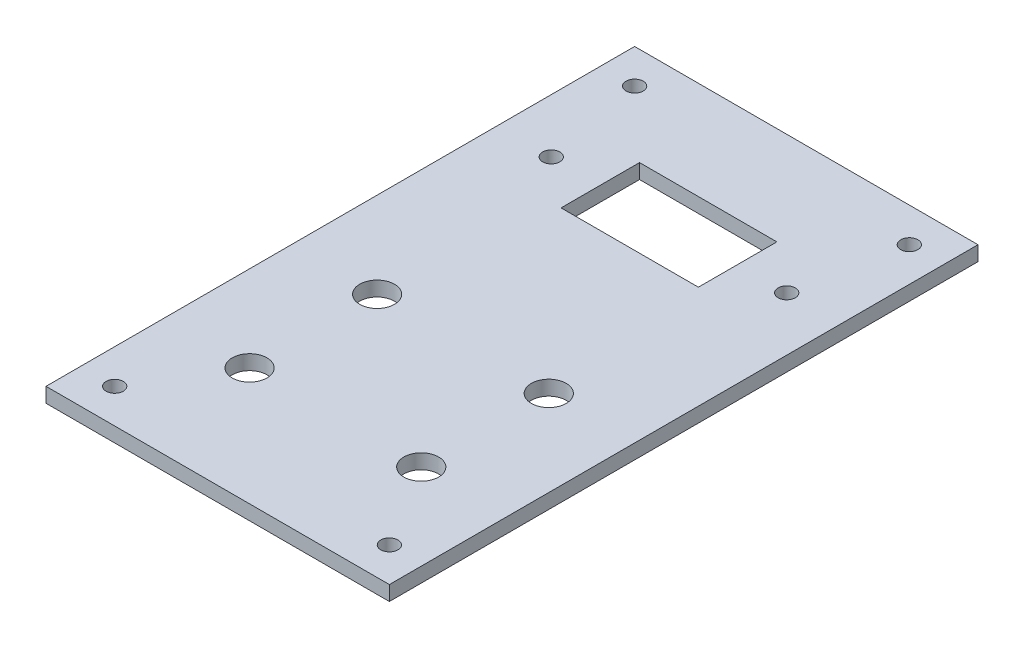
ISO-10303-21;
HEADER;
FILE_DESCRIPTION(('STEP AP214'),'2;1');
FILE_NAME('part.step','',(''),(''),'','','');
FILE_SCHEMA(('AUTOMOTIVE_DESIGN { 1 0 10303 214 1 1 1 1 }'));
ENDSEC;
DATA;
#1=APPLICATION_CONTEXT('core data for automotive mechanical design processes');
#2=APPLICATION_PROTOCOL_DEFINITION('international standard','automotive_design',2000,#1);
#3=PRODUCT_CONTEXT('',#1,'mechanical');
#4=PRODUCT('Part','Part','',(#3));
#5=PRODUCT_RELATED_PRODUCT_CATEGORY('part','',(#4));
#6=PRODUCT_DEFINITION_FORMATION('','',#4);
#7=PRODUCT_DEFINITION_CONTEXT('part definition',#1,'design');
#8=PRODUCT_DEFINITION('design','',#6,#7);
#9=PRODUCT_DEFINITION_SHAPE('','',#8);
#10=(LENGTH_UNIT() NAMED_UNIT(*) SI_UNIT(.MILLI.,.METRE.));
#11=(NAMED_UNIT(*) PLANE_ANGLE_UNIT() SI_UNIT($,.RADIAN.));
#12=(NAMED_UNIT(*) SI_UNIT($,.STERADIAN.) SOLID_ANGLE_UNIT());
#13=UNCERTAINTY_MEASURE_WITH_UNIT(LENGTH_MEASURE(1.E-05),#10,'distance_accuracy_value','');
#14=(GEOMETRIC_REPRESENTATION_CONTEXT(3) GLOBAL_UNCERTAINTY_ASSIGNED_CONTEXT((#13)) GLOBAL_UNIT_ASSIGNED_CONTEXT((#10,
#11,#12)) REPRESENTATION_CONTEXT('',''));
#15=CARTESIAN_POINT('',(0.,0.,0.));
#16=DIRECTION('',(0.,0.,1.));
#17=DIRECTION('',(1.,0.,0.));
#18=AXIS2_PLACEMENT_3D('',#15,#16,#17);
#19=CARTESIAN_POINT('',(0.,3.,0.));
#20=DIRECTION('',(1.,0.,0.));
#21=DIRECTION('',(0.,0.,-1.));
#22=AXIS2_PLACEMENT_3D('',#19,#20,#21);
#23=PLANE('',#22);
#24=DIRECTION('',(0.,0.,1.));
#25=VECTOR('',#24,1.);
#26=CARTESIAN_POINT('',(0.,0.,0.));
#27=LINE('',#26,#25);
#28=CARTESIAN_POINT('',(0.,0.,-120.));
#29=VERTEX_POINT('',#28);
#30=CARTESIAN_POINT('',(0.,0.,0.));
#31=VERTEX_POINT('',#30);
#32=EDGE_CURVE('E145',#29,#31,#27,.T.);
#33=ORIENTED_EDGE('',*,*,#32,.T.);
#34=DIRECTION('',(0.,-1.,0.));
#35=VECTOR('',#34,1.);
#36=CARTESIAN_POINT('',(0.,3.,0.));
#37=LINE('',#36,#35);
#38=CARTESIAN_POINT('',(0.,3.,0.));
#39=VERTEX_POINT('',#38);
#40=EDGE_CURVE('E11',#39,#31,#37,.T.);
#41=ORIENTED_EDGE('',*,*,#40,.F.);
#42=DIRECTION('',(0.,0.,1.));
#43=VECTOR('',#42,1.);
#44=CARTESIAN_POINT('',(0.,3.,0.));
#45=LINE('',#44,#43);
#46=CARTESIAN_POINT('',(0.,3.,-120.));
#47=VERTEX_POINT('',#46);
#48=EDGE_CURVE('E147',#47,#39,#45,.T.);
#49=ORIENTED_EDGE('',*,*,#48,.F.);
#50=DIRECTION('',(0.,-1.,0.));
#51=VECTOR('',#50,1.);
#52=CARTESIAN_POINT('',(0.,3.,-120.));
#53=LINE('',#52,#51);
#54=EDGE_CURVE('E156',#47,#29,#53,.T.);
#55=ORIENTED_EDGE('',*,*,#54,.T.);
#56=EDGE_LOOP('',(#33,#41,#49,#55));
#57=FACE_BOUND('',#56,.T.);
#58=ADVANCED_FACE('F39',(#57),#23,.F.);
#59=CARTESIAN_POINT('',(0.,3.,0.));
#60=DIRECTION('',(0.,0.,-1.));
#61=DIRECTION('',(-1.,0.,0.));
#62=AXIS2_PLACEMENT_3D('',#59,#60,#61);
#63=PLANE('',#62);
#64=DIRECTION('',(1.,0.,0.));
#65=VECTOR('',#64,1.);
#66=CARTESIAN_POINT('',(0.,0.,0.));
#67=LINE('',#66,#65);
#68=CARTESIAN_POINT('',(70.,0.,0.));
#69=VERTEX_POINT('',#68);
#70=EDGE_CURVE('E158',#31,#69,#67,.T.);
#71=ORIENTED_EDGE('',*,*,#70,.T.);
#72=DIRECTION('',(0.,-1.,0.));
#73=VECTOR('',#72,1.);
#74=CARTESIAN_POINT('',(70.,3.,0.));
#75=LINE('',#74,#73);
#76=CARTESIAN_POINT('',(70.,3.,0.));
#77=VERTEX_POINT('',#76);
#78=EDGE_CURVE('E50',#77,#69,#75,.T.);
#79=ORIENTED_EDGE('',*,*,#78,.F.);
#80=DIRECTION('',(1.,0.,0.));
#81=VECTOR('',#80,1.);
#82=CARTESIAN_POINT('',(0.,3.,0.));
#83=LINE('',#82,#81);
#84=EDGE_CURVE('E146',#39,#77,#83,.T.);
#85=ORIENTED_EDGE('',*,*,#84,.F.);
#86=ORIENTED_EDGE('',*,*,#40,.T.);
#87=EDGE_LOOP('',(#71,#79,#85,#86));
#88=FACE_BOUND('',#87,.T.);
#89=ADVANCED_FACE('F249',(#88),#63,.F.);
#90=CARTESIAN_POINT('',(70.,3.,0.));
#91=DIRECTION('',(-1.,0.,0.));
#92=DIRECTION('',(0.,0.,1.));
#93=AXIS2_PLACEMENT_3D('',#90,#91,#92);
#94=PLANE('',#93);
#95=DIRECTION('',(0.,0.,-1.));
#96=VECTOR('',#95,1.);
#97=CARTESIAN_POINT('',(70.,0.,0.));
#98=LINE('',#97,#96);
#99=CARTESIAN_POINT('',(70.,0.,-120.));
#100=VERTEX_POINT('',#99);
#101=EDGE_CURVE('E163',#69,#100,#98,.T.);
#102=ORIENTED_EDGE('',*,*,#101,.T.);
#103=DIRECTION('',(0.,-1.,0.));
#104=VECTOR('',#103,1.);
#105=CARTESIAN_POINT('',(70.,3.,-120.));
#106=LINE('',#105,#104);
#107=CARTESIAN_POINT('',(70.,3.,-120.));
#108=VERTEX_POINT('',#107);
#109=EDGE_CURVE('E168',#108,#100,#106,.T.);
#110=ORIENTED_EDGE('',*,*,#109,.F.);
#111=DIRECTION('',(0.,0.,-1.));
#112=VECTOR('',#111,1.);
#113=CARTESIAN_POINT('',(70.,3.,0.));
#114=LINE('',#113,#112);
#115=EDGE_CURVE('E155',#77,#108,#114,.T.);
#116=ORIENTED_EDGE('',*,*,#115,.F.);
#117=ORIENTED_EDGE('',*,*,#78,.T.);
#118=EDGE_LOOP('',(#102,#110,#116,#117));
#119=FACE_BOUND('',#118,.T.);
#120=ADVANCED_FACE('F253',(#119),#94,.F.);
#121=CARTESIAN_POINT('',(0.,3.,-120.));
#122=DIRECTION('',(0.,0.,1.));
#123=DIRECTION('',(1.,0.,0.));
#124=AXIS2_PLACEMENT_3D('',#121,#122,#123);
#125=PLANE('',#124);
#126=DIRECTION('',(-1.,0.,0.));
#127=VECTOR('',#126,1.);
#128=CARTESIAN_POINT('',(0.,0.,-120.));
#129=LINE('',#128,#127);
#130=EDGE_CURVE('E148',#100,#29,#129,.T.);
#131=ORIENTED_EDGE('',*,*,#130,.T.);
#132=ORIENTED_EDGE('',*,*,#54,.F.);
#133=DIRECTION('',(-1.,0.,0.));
#134=VECTOR('',#133,1.);
#135=CARTESIAN_POINT('',(0.,3.,-120.));
#136=LINE('',#135,#134);
#137=EDGE_CURVE('E152',#108,#47,#136,.T.);
#138=ORIENTED_EDGE('',*,*,#137,.F.);
#139=ORIENTED_EDGE('',*,*,#109,.T.);
#140=EDGE_LOOP('',(#131,#132,#138,#139));
#141=FACE_BOUND('',#140,.T.);
#142=ADVANCED_FACE('F270',(#141),#125,.F.);
#143=CARTESIAN_POINT('',(0.,3.,0.));
#144=DIRECTION('',(0.,-1.,0.));
#145=DIRECTION('',(0.,0.,-1.));
#146=AXIS2_PLACEMENT_3D('',#143,#144,#145);
#147=PLANE('',#146);
#148=CARTESIAN_POINT('',(17.5,3.,-50.));
#149=DIRECTION('',(0.,1.,0.));
#150=DIRECTION('',(0.,0.,1.));
#151=AXIS2_PLACEMENT_3D('',#148,#149,#150);
#152=CIRCLE('',#151,3.55);
#153=CARTESIAN_POINT('',(17.5,3.,-46.45));
#154=VERTEX_POINT('',#153);
#155=EDGE_CURVE('E175',#154,#154,#152,.T.);
#156=ORIENTED_EDGE('',*,*,#155,.F.);
#157=EDGE_LOOP('',(#156));
#158=FACE_BOUND('',#157,.T.);
#159=CARTESIAN_POINT('',(52.5,3.,-50.));
#160=DIRECTION('',(0.,1.,0.));
#161=DIRECTION('',(0.,0.,1.));
#162=AXIS2_PLACEMENT_3D('',#159,#160,#161);
#163=CIRCLE('',#162,3.55000000000001);
#164=CARTESIAN_POINT('',(52.5,3.,-46.45));
#165=VERTEX_POINT('',#164);
#166=EDGE_CURVE('E178',#165,#165,#163,.T.);
#167=ORIENTED_EDGE('',*,*,#166,.F.);
#168=EDGE_LOOP('',(#167));
#169=FACE_BOUND('',#168,.T.);
#170=CARTESIAN_POINT('',(11.,3.,-92.0000000000001));
#171=DIRECTION('',(0.,1.,0.));
#172=DIRECTION('',(0.,0.,1.));
#173=AXIS2_PLACEMENT_3D('',#170,#171,#172);
#174=CIRCLE('',#173,1.75000000000001);
#175=CARTESIAN_POINT('',(11.,3.,-90.2500000000001));
#176=VERTEX_POINT('',#175);
#177=EDGE_CURVE('E136',#176,#176,#174,.T.);
#178=ORIENTED_EDGE('',*,*,#177,.F.);
#179=EDGE_LOOP('',(#178));
#180=FACE_BOUND('',#179,.T.);
#181=CARTESIAN_POINT('',(59.,3.,-92.0000000000001));
#182=DIRECTION('',(0.,1.,0.));
#183=DIRECTION('',(0.,0.,1.));
#184=AXIS2_PLACEMENT_3D('',#181,#182,#183);
#185=CIRCLE('',#184,1.75);
#186=CARTESIAN_POINT('',(59.,3.,-90.2500000000001));
#187=VERTEX_POINT('',#186);
#188=EDGE_CURVE('E214',#187,#187,#185,.T.);
#189=ORIENTED_EDGE('',*,*,#188,.F.);
#190=EDGE_LOOP('',(#189));
#191=FACE_BOUND('',#190,.T.);
#192=CARTESIAN_POINT('',(52.5,3.,-24.));
#193=DIRECTION('',(0.,1.,0.));
#194=DIRECTION('',(0.,0.,1.));
#195=AXIS2_PLACEMENT_3D('',#192,#193,#194);
#196=CIRCLE('',#195,3.55);
#197=CARTESIAN_POINT('',(52.5,3.,-20.45));
#198=VERTEX_POINT('',#197);
#199=EDGE_CURVE('E217',#198,#198,#196,.T.);
#200=ORIENTED_EDGE('',*,*,#199,.F.);
#201=EDGE_LOOP('',(#200));
#202=FACE_BOUND('',#201,.T.);
#203=CARTESIAN_POINT('',(17.5,3.,-24.));
#204=DIRECTION('',(0.,1.,0.));
#205=DIRECTION('',(0.,0.,1.));
#206=AXIS2_PLACEMENT_3D('',#203,#204,#205);
#207=CIRCLE('',#206,3.55);
#208=CARTESIAN_POINT('',(17.5,3.,-20.45));
#209=VERTEX_POINT('',#208);
#210=EDGE_CURVE('E223',#209,#209,#207,.T.);
#211=ORIENTED_EDGE('',*,*,#210,.F.);
#212=EDGE_LOOP('',(#211));
#213=FACE_BOUND('',#212,.T.);
#214=CARTESIAN_POINT('',(7.,3.,-113.));
#215=DIRECTION('',(0.,1.,0.));
#216=DIRECTION('',(0.,0.,1.));
#217=AXIS2_PLACEMENT_3D('',#214,#215,#216);
#218=CIRCLE('',#217,1.75);
#219=CARTESIAN_POINT('',(7.,3.,-111.25));
#220=VERTEX_POINT('',#219);
#221=EDGE_CURVE('E184',#220,#220,#218,.T.);
#222=ORIENTED_EDGE('',*,*,#221,.F.);
#223=EDGE_LOOP('',(#222));
#224=FACE_BOUND('',#223,.T.);
#225=CARTESIAN_POINT('',(63.,3.,-113.));
#226=DIRECTION('',(0.,1.,0.));
#227=DIRECTION('',(0.,0.,1.));
#228=AXIS2_PLACEMENT_3D('',#225,#226,#227);
#229=CIRCLE('',#228,1.75);
#230=CARTESIAN_POINT('',(63.,3.,-111.25));
#231=VERTEX_POINT('',#230);
#232=EDGE_CURVE('E192',#231,#231,#229,.T.);
#233=ORIENTED_EDGE('',*,*,#232,.F.);
#234=EDGE_LOOP('',(#233));
#235=FACE_BOUND('',#234,.T.);
#236=CARTESIAN_POINT('',(63.,3.,-7.));
#237=DIRECTION('',(0.,1.,0.));
#238=DIRECTION('',(0.,0.,1.));
#239=AXIS2_PLACEMENT_3D('',#236,#237,#238);
#240=CIRCLE('',#239,1.75);
#241=CARTESIAN_POINT('',(63.,3.,-5.25));
#242=VERTEX_POINT('',#241);
#243=EDGE_CURVE('E200',#242,#242,#240,.T.);
#244=ORIENTED_EDGE('',*,*,#243,.F.);
#245=EDGE_LOOP('',(#244));
#246=FACE_BOUND('',#245,.T.);
#247=CARTESIAN_POINT('',(7.,3.,-7.));
#248=DIRECTION('',(0.,1.,0.));
#249=DIRECTION('',(0.,0.,1.));
#250=AXIS2_PLACEMENT_3D('',#247,#248,#249);
#251=CIRCLE('',#250,1.75);
#252=CARTESIAN_POINT('',(7.,3.,-5.25));
#253=VERTEX_POINT('',#252);
#254=EDGE_CURVE('E204',#253,#253,#251,.T.);
#255=ORIENTED_EDGE('',*,*,#254,.F.);
#256=EDGE_LOOP('',(#255));
#257=FACE_BOUND('',#256,.T.);
#258=DIRECTION('',(1.,0.,0.));
#259=VECTOR('',#258,1.);
#260=CARTESIAN_POINT('',(21.,3.,-84.));
#261=LINE('',#260,#259);
#262=CARTESIAN_POINT('',(21.,3.,-84.));
#263=VERTEX_POINT('',#262);
#264=CARTESIAN_POINT('',(49.,3.,-84.));
#265=VERTEX_POINT('',#264);
#266=EDGE_CURVE('E134',#263,#265,#261,.T.);
#267=ORIENTED_EDGE('',*,*,#266,.F.);
#268=DIRECTION('',(0.,0.,1.));
#269=VECTOR('',#268,1.);
#270=CARTESIAN_POINT('',(21.,3.,-100.));
#271=LINE('',#270,#269);
#272=CARTESIAN_POINT('',(21.,3.,-100.));
#273=VERTEX_POINT('',#272);
#274=EDGE_CURVE('E54',#273,#263,#271,.T.);
#275=ORIENTED_EDGE('',*,*,#274,.F.);
#276=DIRECTION('',(-1.,0.,0.));
#277=VECTOR('',#276,1.);
#278=CARTESIAN_POINT('',(21.,3.,-100.));
#279=LINE('',#278,#277);
#280=CARTESIAN_POINT('',(49.,3.,-100.));
#281=VERTEX_POINT('',#280);
#282=EDGE_CURVE('E124',#281,#273,#279,.T.);
#283=ORIENTED_EDGE('',*,*,#282,.F.);
#284=DIRECTION('',(0.,0.,-1.));
#285=VECTOR('',#284,1.);
#286=CARTESIAN_POINT('',(49.,3.,-100.));
#287=LINE('',#286,#285);
#288=EDGE_CURVE('E127',#265,#281,#287,.T.);
#289=ORIENTED_EDGE('',*,*,#288,.F.);
#290=EDGE_LOOP('',(#267,#275,#283,#289));
#291=FACE_BOUND('',#290,.T.);
#292=ORIENTED_EDGE('',*,*,#48,.T.);
#293=ORIENTED_EDGE('',*,*,#84,.T.);
#294=ORIENTED_EDGE('',*,*,#115,.T.);
#295=ORIENTED_EDGE('',*,*,#137,.T.);
#296=EDGE_LOOP('',(#292,#293,#294,#295));
#297=FACE_BOUND('',#296,.T.);
#298=ADVANCED_FACE('F266',(#158,#169,#180,#191,#202,#213,#224,#235,#246,#257,#291,#297),#147,.F.);
#299=CARTESIAN_POINT('',(0.,0.,0.));
#300=DIRECTION('',(0.,-1.,0.));
#301=DIRECTION('',(0.,0.,-1.));
#302=AXIS2_PLACEMENT_3D('',#299,#300,#301);
#303=PLANE('',#302);
#304=CARTESIAN_POINT('',(17.5,0.,-50.));
#305=DIRECTION('',(0.,-1.,0.));
#306=DIRECTION('',(0.,0.,-1.));
#307=AXIS2_PLACEMENT_3D('',#304,#305,#306);
#308=CIRCLE('',#307,3.55);
#309=CARTESIAN_POINT('',(17.5,0.,-53.55));
#310=VERTEX_POINT('',#309);
#311=EDGE_CURVE('E45',#310,#310,#308,.T.);
#312=ORIENTED_EDGE('',*,*,#311,.F.);
#313=EDGE_LOOP('',(#312));
#314=FACE_BOUND('',#313,.T.);
#315=CARTESIAN_POINT('',(52.5,0.,-50.));
#316=DIRECTION('',(0.,-1.,0.));
#317=DIRECTION('',(0.,0.,-1.));
#318=AXIS2_PLACEMENT_3D('',#315,#316,#317);
#319=CIRCLE('',#318,3.55000000000001);
#320=CARTESIAN_POINT('',(52.5,0.,-53.55));
#321=VERTEX_POINT('',#320);
#322=EDGE_CURVE('E167',#321,#321,#319,.T.);
#323=ORIENTED_EDGE('',*,*,#322,.F.);
#324=EDGE_LOOP('',(#323));
#325=FACE_BOUND('',#324,.T.);
#326=CARTESIAN_POINT('',(11.,0.,-92.0000000000001));
#327=DIRECTION('',(0.,1.,0.));
#328=DIRECTION('',(0.,0.,1.));
#329=AXIS2_PLACEMENT_3D('',#326,#327,#328);
#330=CIRCLE('',#329,1.75000000000001);
#331=CARTESIAN_POINT('',(11.,0.,-90.2500000000001));
#332=VERTEX_POINT('',#331);
#333=EDGE_CURVE('E208',#332,#332,#330,.T.);
#334=ORIENTED_EDGE('',*,*,#333,.T.);
#335=EDGE_LOOP('',(#334));
#336=FACE_BOUND('',#335,.T.);
#337=CARTESIAN_POINT('',(59.,0.,-92.0000000000001));
#338=DIRECTION('',(0.,1.,0.));
#339=DIRECTION('',(0.,0.,1.));
#340=AXIS2_PLACEMENT_3D('',#337,#338,#339);
#341=CIRCLE('',#340,1.75);
#342=CARTESIAN_POINT('',(59.,0.,-90.2500000000001));
#343=VERTEX_POINT('',#342);
#344=EDGE_CURVE('E216',#343,#343,#341,.T.);
#345=ORIENTED_EDGE('',*,*,#344,.T.);
#346=EDGE_LOOP('',(#345));
#347=FACE_BOUND('',#346,.T.);
#348=CARTESIAN_POINT('',(52.5,0.,-24.));
#349=DIRECTION('',(0.,1.,0.));
#350=DIRECTION('',(0.,0.,1.));
#351=AXIS2_PLACEMENT_3D('',#348,#349,#350);
#352=CIRCLE('',#351,3.55);
#353=CARTESIAN_POINT('',(52.5,0.,-20.45));
#354=VERTEX_POINT('',#353);
#355=EDGE_CURVE('E222',#354,#354,#352,.T.);
#356=ORIENTED_EDGE('',*,*,#355,.T.);
#357=EDGE_LOOP('',(#356));
#358=FACE_BOUND('',#357,.T.);
#359=CARTESIAN_POINT('',(17.5,0.,-24.));
#360=DIRECTION('',(0.,1.,0.));
#361=DIRECTION('',(0.,0.,1.));
#362=AXIS2_PLACEMENT_3D('',#359,#360,#361);
#363=CIRCLE('',#362,3.55);
#364=CARTESIAN_POINT('',(17.5,0.,-20.45));
#365=VERTEX_POINT('',#364);
#366=EDGE_CURVE('E126',#365,#365,#363,.T.);
#367=ORIENTED_EDGE('',*,*,#366,.T.);
#368=EDGE_LOOP('',(#367));
#369=FACE_BOUND('',#368,.T.);
#370=CARTESIAN_POINT('',(7.,0.,-113.));
#371=DIRECTION('',(0.,1.,0.));
#372=DIRECTION('',(0.,0.,1.));
#373=AXIS2_PLACEMENT_3D('',#370,#371,#372);
#374=CIRCLE('',#373,1.75);
#375=CARTESIAN_POINT('',(7.,0.,-111.25));
#376=VERTEX_POINT('',#375);
#377=EDGE_CURVE('E189',#376,#376,#374,.T.);
#378=ORIENTED_EDGE('',*,*,#377,.T.);
#379=EDGE_LOOP('',(#378));
#380=FACE_BOUND('',#379,.T.);
#381=CARTESIAN_POINT('',(63.,0.,-113.));
#382=DIRECTION('',(0.,1.,0.));
#383=DIRECTION('',(0.,0.,1.));
#384=AXIS2_PLACEMENT_3D('',#381,#382,#383);
#385=CIRCLE('',#384,1.75);
#386=CARTESIAN_POINT('',(63.,0.,-111.25));
#387=VERTEX_POINT('',#386);
#388=EDGE_CURVE('E191',#387,#387,#385,.T.);
#389=ORIENTED_EDGE('',*,*,#388,.T.);
#390=EDGE_LOOP('',(#389));
#391=FACE_BOUND('',#390,.T.);
#392=CARTESIAN_POINT('',(63.,0.,-7.));
#393=DIRECTION('',(0.,1.,0.));
#394=DIRECTION('',(0.,0.,1.));
#395=AXIS2_PLACEMENT_3D('',#392,#393,#394);
#396=CIRCLE('',#395,1.75);
#397=CARTESIAN_POINT('',(63.,0.,-5.25));
#398=VERTEX_POINT('',#397);
#399=EDGE_CURVE('E199',#398,#398,#396,.T.);
#400=ORIENTED_EDGE('',*,*,#399,.T.);
#401=EDGE_LOOP('',(#400));
#402=FACE_BOUND('',#401,.T.);
#403=CARTESIAN_POINT('',(7.,0.,-7.));
#404=DIRECTION('',(0.,1.,0.));
#405=DIRECTION('',(0.,0.,1.));
#406=AXIS2_PLACEMENT_3D('',#403,#404,#405);
#407=CIRCLE('',#406,1.75);
#408=CARTESIAN_POINT('',(7.,0.,-5.25));
#409=VERTEX_POINT('',#408);
#410=EDGE_CURVE('E176',#409,#409,#407,.T.);
#411=ORIENTED_EDGE('',*,*,#410,.T.);
#412=EDGE_LOOP('',(#411));
#413=FACE_BOUND('',#412,.T.);
#414=DIRECTION('',(0.,0.,1.));
#415=VECTOR('',#414,1.);
#416=CARTESIAN_POINT('',(21.,0.,-100.));
#417=LINE('',#416,#415);
#418=CARTESIAN_POINT('',(21.,0.,-100.));
#419=VERTEX_POINT('',#418);
#420=CARTESIAN_POINT('',(21.,0.,-84.));
#421=VERTEX_POINT('',#420);
#422=EDGE_CURVE('E110',#419,#421,#417,.T.);
#423=ORIENTED_EDGE('',*,*,#422,.T.);
#424=DIRECTION('',(1.,0.,0.));
#425=VECTOR('',#424,1.);
#426=CARTESIAN_POINT('',(21.,0.,-84.));
#427=LINE('',#426,#425);
#428=CARTESIAN_POINT('',(49.,0.,-84.));
#429=VERTEX_POINT('',#428);
#430=EDGE_CURVE('E116',#421,#429,#427,.T.);
#431=ORIENTED_EDGE('',*,*,#430,.T.);
#432=DIRECTION('',(0.,0.,-1.));
#433=VECTOR('',#432,1.);
#434=CARTESIAN_POINT('',(49.,0.,-100.));
#435=LINE('',#434,#433);
#436=CARTESIAN_POINT('',(49.,0.,-100.));
#437=VERTEX_POINT('',#436);
#438=EDGE_CURVE('E64',#429,#437,#435,.T.);
#439=ORIENTED_EDGE('',*,*,#438,.T.);
#440=DIRECTION('',(-1.,0.,0.));
#441=VECTOR('',#440,1.);
#442=CARTESIAN_POINT('',(21.,0.,-100.));
#443=LINE('',#442,#441);
#444=EDGE_CURVE('E113',#437,#419,#443,.T.);
#445=ORIENTED_EDGE('',*,*,#444,.T.);
#446=EDGE_LOOP('',(#423,#431,#439,#445));
#447=FACE_BOUND('',#446,.T.);
#448=ORIENTED_EDGE('',*,*,#32,.F.);
#449=ORIENTED_EDGE('',*,*,#130,.F.);
#450=ORIENTED_EDGE('',*,*,#101,.F.);
#451=ORIENTED_EDGE('',*,*,#70,.F.);
#452=EDGE_LOOP('',(#448,#449,#450,#451));
#453=FACE_BOUND('',#452,.T.);
#454=ADVANCED_FACE('F119',(#314,#325,#336,#347,#358,#369,#380,#391,#402,#413,#447,#453),#303,.T.);
#455=CARTESIAN_POINT('',(21.,0.,-100.));
#456=DIRECTION('',(-1.,0.,0.));
#457=DIRECTION('',(0.,0.,1.));
#458=AXIS2_PLACEMENT_3D('',#455,#456,#457);
#459=PLANE('',#458);
#460=ORIENTED_EDGE('',*,*,#274,.T.);
#461=DIRECTION('',(0.,1.,0.));
#462=VECTOR('',#461,1.);
#463=CARTESIAN_POINT('',(21.,0.,-84.));
#464=LINE('',#463,#462);
#465=EDGE_CURVE('E101',#421,#263,#464,.T.);
#466=ORIENTED_EDGE('',*,*,#465,.F.);
#467=ORIENTED_EDGE('',*,*,#422,.F.);
#468=DIRECTION('',(0.,1.,0.));
#469=VECTOR('',#468,1.);
#470=CARTESIAN_POINT('',(21.,0.,-100.));
#471=LINE('',#470,#469);
#472=EDGE_CURVE('E140',#419,#273,#471,.T.);
#473=ORIENTED_EDGE('',*,*,#472,.T.);
#474=EDGE_LOOP('',(#460,#466,#467,#473));
#475=FACE_BOUND('',#474,.T.);
#476=ADVANCED_FACE('F102',(#475),#459,.F.);
#477=CARTESIAN_POINT('',(21.,0.,-100.));
#478=DIRECTION('',(0.,0.,-1.));
#479=DIRECTION('',(-1.,0.,0.));
#480=AXIS2_PLACEMENT_3D('',#477,#478,#479);
#481=PLANE('',#480);
#482=ORIENTED_EDGE('',*,*,#282,.T.);
#483=ORIENTED_EDGE('',*,*,#472,.F.);
#484=ORIENTED_EDGE('',*,*,#444,.F.);
#485=DIRECTION('',(0.,1.,0.));
#486=VECTOR('',#485,1.);
#487=CARTESIAN_POINT('',(49.,0.,-100.));
#488=LINE('',#487,#486);
#489=EDGE_CURVE('E141',#437,#281,#488,.T.);
#490=ORIENTED_EDGE('',*,*,#489,.T.);
#491=EDGE_LOOP('',(#482,#483,#484,#490));
#492=FACE_BOUND('',#491,.T.);
#493=ADVANCED_FACE('F287',(#492),#481,.F.);
#494=CARTESIAN_POINT('',(49.,0.,-100.));
#495=DIRECTION('',(1.,0.,0.));
#496=DIRECTION('',(0.,0.,-1.));
#497=AXIS2_PLACEMENT_3D('',#494,#495,#496);
#498=PLANE('',#497);
#499=ORIENTED_EDGE('',*,*,#288,.T.);
#500=ORIENTED_EDGE('',*,*,#489,.F.);
#501=ORIENTED_EDGE('',*,*,#438,.F.);
#502=DIRECTION('',(0.,1.,0.));
#503=VECTOR('',#502,1.);
#504=CARTESIAN_POINT('',(49.,0.,-84.));
#505=LINE('',#504,#503);
#506=EDGE_CURVE('E115',#429,#265,#505,.T.);
#507=ORIENTED_EDGE('',*,*,#506,.T.);
#508=EDGE_LOOP('',(#499,#500,#501,#507));
#509=FACE_BOUND('',#508,.T.);
#510=ADVANCED_FACE('F293',(#509),#498,.F.);
#511=CARTESIAN_POINT('',(21.,0.,-84.));
#512=DIRECTION('',(0.,0.,1.));
#513=DIRECTION('',(1.,0.,0.));
#514=AXIS2_PLACEMENT_3D('',#511,#512,#513);
#515=PLANE('',#514);
#516=ORIENTED_EDGE('',*,*,#266,.T.);
#517=ORIENTED_EDGE('',*,*,#506,.F.);
#518=ORIENTED_EDGE('',*,*,#430,.F.);
#519=ORIENTED_EDGE('',*,*,#465,.T.);
#520=EDGE_LOOP('',(#516,#517,#518,#519));
#521=FACE_BOUND('',#520,.T.);
#522=ADVANCED_FACE('F120',(#521),#515,.F.);
#523=CARTESIAN_POINT('',(7.,0.,-7.));
#524=DIRECTION('',(0.,1.,0.));
#525=DIRECTION('',(0.,0.,1.));
#526=AXIS2_PLACEMENT_3D('',#523,#524,#525);
#527=CYLINDRICAL_SURFACE('',#526,1.75);
#528=ORIENTED_EDGE('',*,*,#410,.F.);
#529=EDGE_LOOP('',(#528));
#530=FACE_BOUND('',#529,.T.);
#531=ORIENTED_EDGE('',*,*,#254,.T.);
#532=EDGE_LOOP('',(#531));
#533=FACE_BOUND('',#532,.T.);
#534=ADVANCED_FACE('F290',(#530,#533),#527,.F.);
#535=CARTESIAN_POINT('',(63.,0.,-7.));
#536=DIRECTION('',(0.,1.,0.));
#537=DIRECTION('',(0.,0.,1.));
#538=AXIS2_PLACEMENT_3D('',#535,#536,#537);
#539=CYLINDRICAL_SURFACE('',#538,1.75);
#540=ORIENTED_EDGE('',*,*,#399,.F.);
#541=EDGE_LOOP('',(#540));
#542=FACE_BOUND('',#541,.T.);
#543=ORIENTED_EDGE('',*,*,#243,.T.);
#544=EDGE_LOOP('',(#543));
#545=FACE_BOUND('',#544,.T.);
#546=ADVANCED_FACE('F316',(#542,#545),#539,.F.);
#547=CARTESIAN_POINT('',(63.,0.,-113.));
#548=DIRECTION('',(0.,1.,0.));
#549=DIRECTION('',(0.,0.,1.));
#550=AXIS2_PLACEMENT_3D('',#547,#548,#549);
#551=CYLINDRICAL_SURFACE('',#550,1.75);
#552=ORIENTED_EDGE('',*,*,#388,.F.);
#553=EDGE_LOOP('',(#552));
#554=FACE_BOUND('',#553,.T.);
#555=ORIENTED_EDGE('',*,*,#232,.T.);
#556=EDGE_LOOP('',(#555));
#557=FACE_BOUND('',#556,.T.);
#558=ADVANCED_FACE('F244',(#554,#557),#551,.F.);
#559=CARTESIAN_POINT('',(7.,0.,-113.));
#560=DIRECTION('',(0.,1.,0.));
#561=DIRECTION('',(0.,0.,1.));
#562=AXIS2_PLACEMENT_3D('',#559,#560,#561);
#563=CYLINDRICAL_SURFACE('',#562,1.75);
#564=ORIENTED_EDGE('',*,*,#377,.F.);
#565=EDGE_LOOP('',(#564));
#566=FACE_BOUND('',#565,.T.);
#567=ORIENTED_EDGE('',*,*,#221,.T.);
#568=EDGE_LOOP('',(#567));
#569=FACE_BOUND('',#568,.T.);
#570=ADVANCED_FACE('F236',(#566,#569),#563,.F.);
#571=CARTESIAN_POINT('',(17.5,0.,-24.));
#572=DIRECTION('',(0.,1.,0.));
#573=DIRECTION('',(0.,0.,1.));
#574=AXIS2_PLACEMENT_3D('',#571,#572,#573);
#575=CYLINDRICAL_SURFACE('',#574,3.55);
#576=ORIENTED_EDGE('',*,*,#366,.F.);
#577=EDGE_LOOP('',(#576));
#578=FACE_BOUND('',#577,.T.);
#579=ORIENTED_EDGE('',*,*,#210,.T.);
#580=EDGE_LOOP('',(#579));
#581=FACE_BOUND('',#580,.T.);
#582=ADVANCED_FACE('F231',(#578,#581),#575,.F.);
#583=CARTESIAN_POINT('',(52.5,0.,-24.));
#584=DIRECTION('',(0.,1.,0.));
#585=DIRECTION('',(0.,0.,1.));
#586=AXIS2_PLACEMENT_3D('',#583,#584,#585);
#587=CYLINDRICAL_SURFACE('',#586,3.55);
#588=ORIENTED_EDGE('',*,*,#355,.F.);
#589=EDGE_LOOP('',(#588));
#590=FACE_BOUND('',#589,.T.);
#591=ORIENTED_EDGE('',*,*,#199,.T.);
#592=EDGE_LOOP('',(#591));
#593=FACE_BOUND('',#592,.T.);
#594=ADVANCED_FACE('F232',(#590,#593),#587,.F.);
#595=CARTESIAN_POINT('',(59.,0.,-92.0000000000001));
#596=DIRECTION('',(0.,1.,0.));
#597=DIRECTION('',(0.,0.,1.));
#598=AXIS2_PLACEMENT_3D('',#595,#596,#597);
#599=CYLINDRICAL_SURFACE('',#598,1.75);
#600=ORIENTED_EDGE('',*,*,#344,.F.);
#601=EDGE_LOOP('',(#600));
#602=FACE_BOUND('',#601,.T.);
#603=ORIENTED_EDGE('',*,*,#188,.T.);
#604=EDGE_LOOP('',(#603));
#605=FACE_BOUND('',#604,.T.);
#606=ADVANCED_FACE('F245',(#602,#605),#599,.F.);
#607=CARTESIAN_POINT('',(11.,0.,-92.0000000000001));
#608=DIRECTION('',(0.,1.,0.));
#609=DIRECTION('',(0.,0.,1.));
#610=AXIS2_PLACEMENT_3D('',#607,#608,#609);
#611=CYLINDRICAL_SURFACE('',#610,1.75000000000001);
#612=ORIENTED_EDGE('',*,*,#333,.F.);
#613=EDGE_LOOP('',(#612));
#614=FACE_BOUND('',#613,.T.);
#615=ORIENTED_EDGE('',*,*,#177,.T.);
#616=EDGE_LOOP('',(#615));
#617=FACE_BOUND('',#616,.T.);
#618=ADVANCED_FACE('F365',(#614,#617),#611,.F.);
#619=CARTESIAN_POINT('',(52.5,-9.,-50.));
#620=DIRECTION('',(0.,1.,0.));
#621=DIRECTION('',(0.,0.,1.));
#622=AXIS2_PLACEMENT_3D('',#619,#620,#621);
#623=CYLINDRICAL_SURFACE('',#622,3.55000000000001);
#624=ORIENTED_EDGE('',*,*,#322,.T.);
#625=EDGE_LOOP('',(#624));
#626=FACE_BOUND('',#625,.T.);
#627=ORIENTED_EDGE('',*,*,#166,.T.);
#628=EDGE_LOOP('',(#627));
#629=FACE_BOUND('',#628,.T.);
#630=ADVANCED_FACE('F375',(#626,#629),#623,.F.);
#631=CARTESIAN_POINT('',(17.5,-9.,-50.));
#632=DIRECTION('',(0.,1.,0.));
#633=DIRECTION('',(0.,0.,1.));
#634=AXIS2_PLACEMENT_3D('',#631,#632,#633);
#635=CYLINDRICAL_SURFACE('',#634,3.55);
#636=ORIENTED_EDGE('',*,*,#311,.T.);
#637=EDGE_LOOP('',(#636));
#638=FACE_BOUND('',#637,.T.);
#639=ORIENTED_EDGE('',*,*,#155,.T.);
#640=EDGE_LOOP('',(#639));
#641=FACE_BOUND('',#640,.T.);
#642=ADVANCED_FACE('F385',(#638,#641),#635,.F.);
#643=CLOSED_SHELL('',(#58,#89,#120,#142,#298,#454,#476,#493,#510,#522,#534,#546,#558,#570,#582,
#594,#606,#618,#630,#642));
#644=MANIFOLD_SOLID_BREP('B2',#643);
#645=ADVANCED_BREP_SHAPE_REPRESENTATION('',(#18,#644),#14);
#646=SHAPE_DEFINITION_REPRESENTATION(#9,#645);
ENDSEC;
END-ISO-10303-21;
